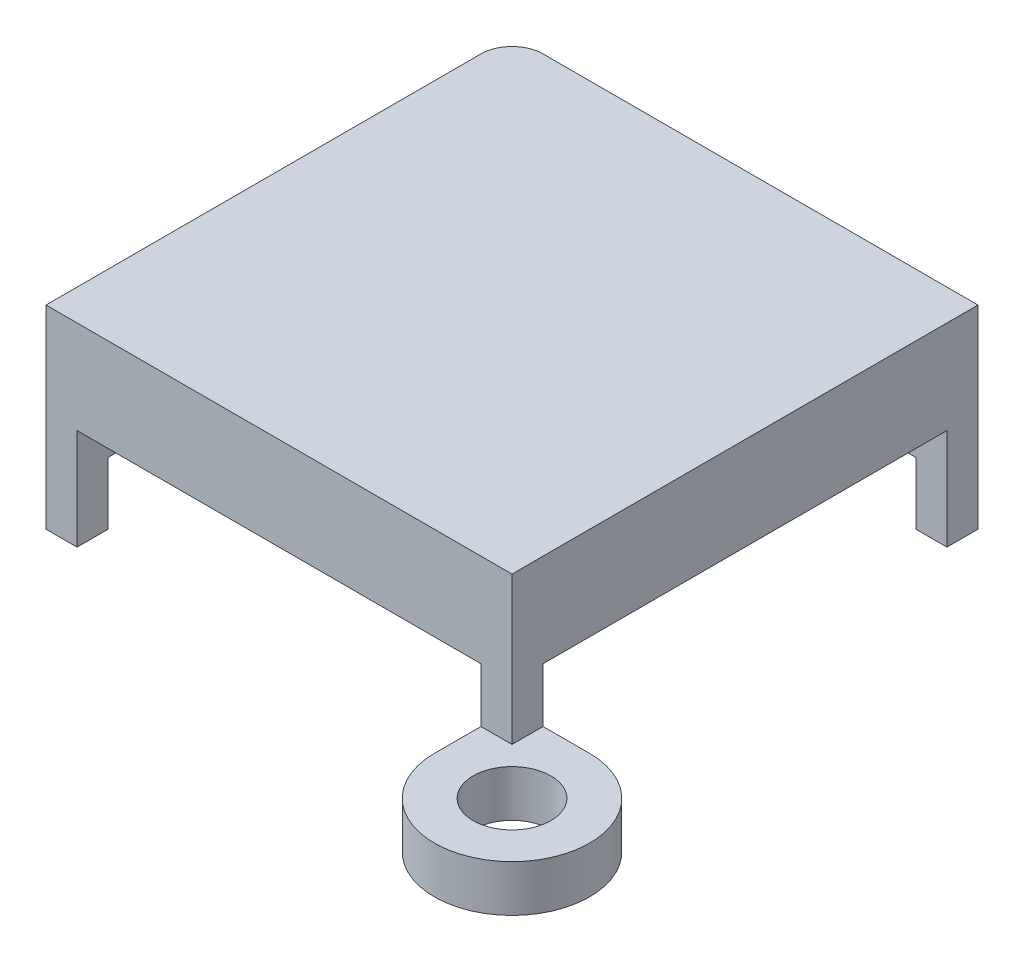
ISO-10303-21;
HEADER;
FILE_DESCRIPTION(('STEP AP214'),'2;1');
FILE_NAME('part.step','',(''),(''),'','','');
FILE_SCHEMA(('AUTOMOTIVE_DESIGN { 1 0 10303 214 1 1 1 1 }'));
ENDSEC;
DATA;
#1=APPLICATION_CONTEXT('core data for automotive mechanical design processes');
#2=APPLICATION_PROTOCOL_DEFINITION('international standard','automotive_design',2000,#1);
#3=PRODUCT_CONTEXT('',#1,'mechanical');
#4=PRODUCT('Part','Part','',(#3));
#5=PRODUCT_RELATED_PRODUCT_CATEGORY('part','',(#4));
#6=PRODUCT_DEFINITION_FORMATION('','',#4);
#7=PRODUCT_DEFINITION_CONTEXT('part definition',#1,'design');
#8=PRODUCT_DEFINITION('design','',#6,#7);
#9=PRODUCT_DEFINITION_SHAPE('','',#8);
#10=(LENGTH_UNIT() NAMED_UNIT(*) SI_UNIT(.MILLI.,.METRE.));
#11=(NAMED_UNIT(*) PLANE_ANGLE_UNIT() SI_UNIT($,.RADIAN.));
#12=(NAMED_UNIT(*) SI_UNIT($,.STERADIAN.) SOLID_ANGLE_UNIT());
#13=UNCERTAINTY_MEASURE_WITH_UNIT(LENGTH_MEASURE(1.E-05),#10,'distance_accuracy_value','');
#14=(GEOMETRIC_REPRESENTATION_CONTEXT(3) GLOBAL_UNCERTAINTY_ASSIGNED_CONTEXT((#13)) GLOBAL_UNIT_ASSIGNED_CONTEXT((#10,
#11,#12)) REPRESENTATION_CONTEXT('',''));
#15=CARTESIAN_POINT('',(0.,0.,0.));
#16=DIRECTION('',(0.,0.,1.));
#17=DIRECTION('',(1.,0.,0.));
#18=AXIS2_PLACEMENT_3D('',#15,#16,#17);
#19=CARTESIAN_POINT('',(0.,-1.2,0.));
#20=DIRECTION('',(0.,-1.,0.));
#21=DIRECTION('',(0.,0.,-1.));
#22=AXIS2_PLACEMENT_3D('',#19,#20,#21);
#23=PLANE('',#22);
#24=DIRECTION('',(0.,0.,-1.));
#25=VECTOR('',#24,1.);
#26=CARTESIAN_POINT('',(-0.5,-1.2,-2.6));
#27=LINE('',#26,#25);
#28=CARTESIAN_POINT('',(-0.5,-1.2,-2.6));
#29=VERTEX_POINT('',#28);
#30=CARTESIAN_POINT('',(-0.5,-1.2,-3.));
#31=VERTEX_POINT('',#30);
#32=EDGE_CURVE('E233',#29,#31,#27,.T.);
#33=ORIENTED_EDGE('',*,*,#32,.F.);
#34=DIRECTION('',(-1.,0.,0.));
#35=VECTOR('',#34,1.);
#36=CARTESIAN_POINT('',(2.6,-1.2,-2.6));
#37=LINE('',#36,#35);
#38=CARTESIAN_POINT('',(-2.6,-1.2,-2.6));
#39=VERTEX_POINT('',#38);
#40=EDGE_CURVE('E292',#29,#39,#37,.T.);
#41=ORIENTED_EDGE('',*,*,#40,.T.);
#42=DIRECTION('',(0.,0.,-1.));
#43=VECTOR('',#42,1.);
#44=CARTESIAN_POINT('',(-2.6,-1.2,-2.6));
#45=LINE('',#44,#43);
#46=CARTESIAN_POINT('',(-2.6,-1.2,-3.));
#47=VERTEX_POINT('',#46);
#48=EDGE_CURVE('E296',#39,#47,#45,.T.);
#49=ORIENTED_EDGE('',*,*,#48,.T.);
#50=DIRECTION('',(1.,0.,0.));
#51=VECTOR('',#50,1.);
#52=CARTESIAN_POINT('',(-2.6,-1.2,-3.));
#53=LINE('',#52,#51);
#54=EDGE_CURVE('E300',#47,#31,#53,.T.);
#55=ORIENTED_EDGE('',*,*,#54,.T.);
#56=EDGE_LOOP('',(#33,#41,#49,#55));
#57=FACE_BOUND('',#56,.T.);
#58=ADVANCED_FACE('F39',(#57),#23,.T.);
#59=CARTESIAN_POINT('',(0.,-1.2,0.));
#60=DIRECTION('',(0.,-1.,0.));
#61=DIRECTION('',(0.,0.,-1.));
#62=AXIS2_PLACEMENT_3D('',#59,#60,#61);
#63=PLANE('',#62);
#64=DIRECTION('',(-1.,0.,0.));
#65=VECTOR('',#64,1.);
#66=CARTESIAN_POINT('',(-3.,-1.2,0.5));
#67=LINE('',#66,#65);
#68=CARTESIAN_POINT('',(-2.6,-1.2,0.5));
#69=VERTEX_POINT('',#68);
#70=CARTESIAN_POINT('',(-3.,-1.2,0.5));
#71=VERTEX_POINT('',#70);
#72=EDGE_CURVE('E269',#69,#71,#67,.T.);
#73=ORIENTED_EDGE('',*,*,#72,.F.);
#74=DIRECTION('',(0.,0.,1.));
#75=VECTOR('',#74,1.);
#76=CARTESIAN_POINT('',(-2.6,-1.2,-2.6));
#77=LINE('',#76,#75);
#78=CARTESIAN_POINT('',(-2.6,-1.2,2.6));
#79=VERTEX_POINT('',#78);
#80=EDGE_CURVE('E305',#69,#79,#77,.T.);
#81=ORIENTED_EDGE('',*,*,#80,.T.);
#82=DIRECTION('',(-1.,0.,0.));
#83=VECTOR('',#82,1.);
#84=CARTESIAN_POINT('',(-2.6,-1.2,2.6));
#85=LINE('',#84,#83);
#86=CARTESIAN_POINT('',(-3.,-1.2,2.6));
#87=VERTEX_POINT('',#86);
#88=EDGE_CURVE('E309',#79,#87,#85,.T.);
#89=ORIENTED_EDGE('',*,*,#88,.T.);
#90=DIRECTION('',(0.,0.,-1.));
#91=VECTOR('',#90,1.);
#92=CARTESIAN_POINT('',(-3.,-1.2,2.6));
#93=LINE('',#92,#91);
#94=EDGE_CURVE('E312',#87,#71,#93,.T.);
#95=ORIENTED_EDGE('',*,*,#94,.T.);
#96=EDGE_LOOP('',(#73,#81,#89,#95));
#97=FACE_BOUND('',#96,.T.);
#98=ADVANCED_FACE('F501',(#97),#63,.T.);
#99=CARTESIAN_POINT('',(-2.6,-2.,2.6));
#100=DIRECTION('',(1.,0.,0.));
#101=DIRECTION('',(0.,0.,-1.));
#102=AXIS2_PLACEMENT_3D('',#99,#100,#101);
#103=PLANE('',#102);
#104=DIRECTION('',(0.,-1.,0.));
#105=VECTOR('',#104,1.);
#106=CARTESIAN_POINT('',(-2.6,-0.7,0.5));
#107=LINE('',#106,#105);
#108=CARTESIAN_POINT('',(-2.6,-0.7,0.5));
#109=VERTEX_POINT('',#108);
#110=EDGE_CURVE('E284',#109,#69,#107,.T.);
#111=ORIENTED_EDGE('',*,*,#110,.F.);
#112=DIRECTION('',(0.,0.,1.));
#113=VECTOR('',#112,1.);
#114=CARTESIAN_POINT('',(-2.6,-0.7,0.5));
#115=LINE('',#114,#113);
#116=CARTESIAN_POINT('',(-2.6,-0.7,-0.5));
#117=VERTEX_POINT('',#116);
#118=EDGE_CURVE('E272',#117,#109,#115,.T.);
#119=ORIENTED_EDGE('',*,*,#118,.F.);
#120=DIRECTION('',(0.,-1.,0.));
#121=VECTOR('',#120,1.);
#122=CARTESIAN_POINT('',(-2.6,-0.7,-0.5));
#123=LINE('',#122,#121);
#124=CARTESIAN_POINT('',(-2.6,-1.2,-0.5));
#125=VERTEX_POINT('',#124);
#126=EDGE_CURVE('E286',#117,#125,#123,.T.);
#127=ORIENTED_EDGE('',*,*,#126,.T.);
#128=EDGE_CURVE('E306',#39,#125,#77,.T.);
#129=ORIENTED_EDGE('',*,*,#128,.F.);
#130=DIRECTION('',(0.,1.,0.));
#131=VECTOR('',#130,1.);
#132=CARTESIAN_POINT('',(-2.6,-2.,-2.6));
#133=LINE('',#132,#131);
#134=CARTESIAN_POINT('',(-2.6,0.,-2.6));
#135=VERTEX_POINT('',#134);
#136=EDGE_CURVE('E421',#39,#135,#133,.T.);
#137=ORIENTED_EDGE('',*,*,#136,.T.);
#138=DIRECTION('',(0.,0.,-1.));
#139=VECTOR('',#138,1.);
#140=CARTESIAN_POINT('',(-2.6,0.,2.6));
#141=LINE('',#140,#139);
#142=CARTESIAN_POINT('',(-2.6,0.,2.6));
#143=VERTEX_POINT('',#142);
#144=EDGE_CURVE('E409',#143,#135,#141,.T.);
#145=ORIENTED_EDGE('',*,*,#144,.F.);
#146=DIRECTION('',(0.,1.,0.));
#147=VECTOR('',#146,1.);
#148=CARTESIAN_POINT('',(-2.6,-2.,2.6));
#149=LINE('',#148,#147);
#150=CARTESIAN_POINT('',(-2.6,-0.7,2.6));
#151=VERTEX_POINT('',#150);
#152=EDGE_CURVE('E423',#151,#143,#149,.T.);
#153=ORIENTED_EDGE('',*,*,#152,.F.);
#154=DIRECTION('',(0.,0.,-1.));
#155=VECTOR('',#154,1.);
#156=CARTESIAN_POINT('',(-2.6,-0.7,3.));
#157=LINE('',#156,#155);
#158=CARTESIAN_POINT('',(-2.6,-0.7,3.));
#159=VERTEX_POINT('',#158);
#160=EDGE_CURVE('E325',#159,#151,#157,.T.);
#161=ORIENTED_EDGE('',*,*,#160,.F.);
#162=DIRECTION('',(0.,1.,0.));
#163=VECTOR('',#162,1.);
#164=CARTESIAN_POINT('',(-2.6,-0.2,3.));
#165=LINE('',#164,#163);
#166=CARTESIAN_POINT('',(-2.6,-2.,3.));
#167=VERTEX_POINT('',#166);
#168=EDGE_CURVE('E365',#167,#159,#165,.T.);
#169=ORIENTED_EDGE('',*,*,#168,.F.);
#170=DIRECTION('',(0.,0.,-1.));
#171=VECTOR('',#170,1.);
#172=CARTESIAN_POINT('',(-2.6,-2.,3.));
#173=LINE('',#172,#171);
#174=CARTESIAN_POINT('',(-2.6,-2.,2.6));
#175=VERTEX_POINT('',#174);
#176=EDGE_CURVE('E372',#167,#175,#173,.T.);
#177=ORIENTED_EDGE('',*,*,#176,.T.);
#178=DIRECTION('',(0.,1.,0.));
#179=VECTOR('',#178,1.);
#180=CARTESIAN_POINT('',(-2.6,-2.,2.6));
#181=LINE('',#180,#179);
#182=EDGE_CURVE('E380',#175,#79,#181,.T.);
#183=ORIENTED_EDGE('',*,*,#182,.T.);
#184=ORIENTED_EDGE('',*,*,#80,.F.);
#185=EDGE_LOOP('',(#111,#119,#127,#129,#137,#145,#153,#161,#169,#177,#183,#184));
#186=FACE_BOUND('',#185,.T.);
#187=ADVANCED_FACE('F496',(#186),#103,.T.);
#188=CARTESIAN_POINT('',(2.6,-2.,-2.6));
#189=DIRECTION('',(-1.,0.,0.));
#190=DIRECTION('',(0.,0.,1.));
#191=AXIS2_PLACEMENT_3D('',#188,#189,#190);
#192=PLANE('',#191);
#193=DIRECTION('',(0.,1.,0.));
#194=VECTOR('',#193,1.);
#195=CARTESIAN_POINT('',(2.6,-2.,-2.6));
#196=LINE('',#195,#194);
#197=CARTESIAN_POINT('',(2.6,-0.7,-2.6));
#198=VERTEX_POINT('',#197);
#199=CARTESIAN_POINT('',(2.6,0.,-2.6));
#200=VERTEX_POINT('',#199);
#201=EDGE_CURVE('E419',#198,#200,#196,.T.);
#202=ORIENTED_EDGE('',*,*,#201,.F.);
#203=DIRECTION('',(0.,0.,-1.));
#204=VECTOR('',#203,1.);
#205=CARTESIAN_POINT('',(2.6,-0.7,2.6));
#206=LINE('',#205,#204);
#207=CARTESIAN_POINT('',(2.6,-0.7,2.6));
#208=VERTEX_POINT('',#207);
#209=EDGE_CURVE('E318',#208,#198,#206,.T.);
#210=ORIENTED_EDGE('',*,*,#209,.F.);
#211=DIRECTION('',(0.,1.,0.));
#212=VECTOR('',#211,1.);
#213=CARTESIAN_POINT('',(2.6,-2.,2.6));
#214=LINE('',#213,#212);
#215=CARTESIAN_POINT('',(2.6,0.,2.6));
#216=VERTEX_POINT('',#215);
#217=EDGE_CURVE('E406',#208,#216,#214,.T.);
#218=ORIENTED_EDGE('',*,*,#217,.T.);
#219=DIRECTION('',(0.,0.,1.));
#220=VECTOR('',#219,1.);
#221=CARTESIAN_POINT('',(2.6,0.,-2.6));
#222=LINE('',#221,#220);
#223=EDGE_CURVE('E415',#200,#216,#222,.T.);
#224=ORIENTED_EDGE('',*,*,#223,.F.);
#225=EDGE_LOOP('',(#202,#210,#218,#224));
#226=FACE_BOUND('',#225,.T.);
#227=ADVANCED_FACE('F493',(#226),#192,.T.);
#228=CARTESIAN_POINT('',(2.6,-2.,2.6));
#229=DIRECTION('',(0.,0.,-1.));
#230=DIRECTION('',(-1.,0.,0.));
#231=AXIS2_PLACEMENT_3D('',#228,#229,#230);
#232=PLANE('',#231);
#233=DIRECTION('',(1.,0.,0.));
#234=VECTOR('',#233,1.);
#235=CARTESIAN_POINT('',(-2.6,-0.7,2.6));
#236=LINE('',#235,#234);
#237=EDGE_CURVE('E328',#151,#208,#236,.T.);
#238=ORIENTED_EDGE('',*,*,#237,.F.);
#239=ORIENTED_EDGE('',*,*,#152,.T.);
#240=DIRECTION('',(-1.,0.,0.));
#241=VECTOR('',#240,1.);
#242=CARTESIAN_POINT('',(2.6,0.,2.6));
#243=LINE('',#242,#241);
#244=EDGE_CURVE('E394',#216,#143,#243,.T.);
#245=ORIENTED_EDGE('',*,*,#244,.F.);
#246=ORIENTED_EDGE('',*,*,#217,.F.);
#247=EDGE_LOOP('',(#238,#239,#245,#246));
#248=FACE_BOUND('',#247,.T.);
#249=ADVANCED_FACE('F614',(#248),#232,.T.);
#250=ORIENTED_EDGE('',*,*,#88,.F.);
#251=ORIENTED_EDGE('',*,*,#182,.F.);
#252=DIRECTION('',(-1.,0.,0.));
#253=VECTOR('',#252,1.);
#254=CARTESIAN_POINT('',(2.6,-2.,2.6));
#255=LINE('',#254,#253);
#256=CARTESIAN_POINT('',(-3.,-2.,2.6));
#257=VERTEX_POINT('',#256);
#258=EDGE_CURVE('E402',#175,#257,#255,.T.);
#259=ORIENTED_EDGE('',*,*,#258,.T.);
#260=DIRECTION('',(0.,1.,0.));
#261=VECTOR('',#260,1.);
#262=CARTESIAN_POINT('',(-3.,-0.2,2.6));
#263=LINE('',#262,#261);
#264=EDGE_CURVE('E391',#257,#87,#263,.T.);
#265=ORIENTED_EDGE('',*,*,#264,.T.);
#266=EDGE_LOOP('',(#250,#251,#259,#265));
#267=FACE_BOUND('',#266,.T.);
#268=ADVANCED_FACE('F567',(#267),#232,.T.);
#269=CARTESIAN_POINT('',(3.,0.5,-3.));
#270=DIRECTION('',(-1.,0.,0.));
#271=DIRECTION('',(0.,0.,1.));
#272=AXIS2_PLACEMENT_3D('',#269,#270,#271);
#273=PLANE('',#272);
#274=DIRECTION('',(0.,0.,1.));
#275=VECTOR('',#274,1.);
#276=CARTESIAN_POINT('',(3.,-0.7,-2.6));
#277=LINE('',#276,#275);
#278=CARTESIAN_POINT('',(3.,-0.7,-2.6));
#279=VERTEX_POINT('',#278);
#280=CARTESIAN_POINT('',(3.,-0.7,2.6));
#281=VERTEX_POINT('',#280);
#282=EDGE_CURVE('E323',#279,#281,#277,.T.);
#283=ORIENTED_EDGE('',*,*,#282,.F.);
#284=DIRECTION('',(0.,-1.,0.));
#285=VECTOR('',#284,1.);
#286=CARTESIAN_POINT('',(3.,-0.2,-2.6));
#287=LINE('',#286,#285);
#288=CARTESIAN_POINT('',(3.,-2.,-2.6));
#289=VERTEX_POINT('',#288);
#290=EDGE_CURVE('E388',#279,#289,#287,.T.);
#291=ORIENTED_EDGE('',*,*,#290,.T.);
#292=DIRECTION('',(0.,0.,1.));
#293=VECTOR('',#292,1.);
#294=CARTESIAN_POINT('',(3.,-2.,-3.));
#295=LINE('',#294,#293);
#296=CARTESIAN_POINT('',(3.,-2.,-3.));
#297=VERTEX_POINT('',#296);
#298=EDGE_CURVE('E427',#297,#289,#295,.T.);
#299=ORIENTED_EDGE('',*,*,#298,.F.);
#300=DIRECTION('',(0.,-1.,0.));
#301=VECTOR('',#300,1.);
#302=CARTESIAN_POINT('',(3.,0.5,-3.));
#303=LINE('',#302,#301);
#304=CARTESIAN_POINT('',(3.,0.5,-3.));
#305=VERTEX_POINT('',#304);
#306=EDGE_CURVE('E450',#305,#297,#303,.T.);
#307=ORIENTED_EDGE('',*,*,#306,.F.);
#308=DIRECTION('',(0.,0.,-1.));
#309=VECTOR('',#308,1.);
#310=CARTESIAN_POINT('',(3.,0.5,-3.));
#311=LINE('',#310,#309);
#312=CARTESIAN_POINT('',(3.,0.5,3.));
#313=VERTEX_POINT('',#312);
#314=EDGE_CURVE('E435',#313,#305,#311,.T.);
#315=ORIENTED_EDGE('',*,*,#314,.F.);
#316=DIRECTION('',(0.,-1.,0.));
#317=VECTOR('',#316,1.);
#318=CARTESIAN_POINT('',(3.,0.5,3.));
#319=LINE('',#318,#317);
#320=CARTESIAN_POINT('',(3.,-1.4,3.));
#321=VERTEX_POINT('',#320);
#322=EDGE_CURVE('E444',#313,#321,#319,.T.);
#323=ORIENTED_EDGE('',*,*,#322,.T.);
#324=DIRECTION('',(0.,0.,1.));
#325=VECTOR('',#324,1.);
#326=CARTESIAN_POINT('',(3.,-1.4,-3.));
#327=LINE('',#326,#325);
#328=CARTESIAN_POINT('',(3.,-1.4,2.6));
#329=VERTEX_POINT('',#328);
#330=EDGE_CURVE('E360',#329,#321,#327,.T.);
#331=ORIENTED_EDGE('',*,*,#330,.F.);
#332=DIRECTION('',(0.,1.,0.));
#333=VECTOR('',#332,1.);
#334=CARTESIAN_POINT('',(3.,-0.2,2.6));
#335=LINE('',#334,#333);
#336=EDGE_CURVE('E390',#329,#281,#335,.T.);
#337=ORIENTED_EDGE('',*,*,#336,.T.);
#338=EDGE_LOOP('',(#283,#291,#299,#307,#315,#323,#331,#337));
#339=FACE_BOUND('',#338,.T.);
#340=ADVANCED_FACE('F586',(#339),#273,.F.);
#341=CARTESIAN_POINT('',(-3.,0.5,3.));
#342=DIRECTION('',(0.,0.,-1.));
#343=DIRECTION('',(-1.,0.,0.));
#344=AXIS2_PLACEMENT_3D('',#341,#342,#343);
#345=PLANE('',#344);
#346=DIRECTION('',(-1.,0.,0.));
#347=VECTOR('',#346,1.);
#348=CARTESIAN_POINT('',(2.6,-0.7,3.));
#349=LINE('',#348,#347);
#350=CARTESIAN_POINT('',(2.6,-0.7,3.));
#351=VERTEX_POINT('',#350);
#352=EDGE_CURVE('E333',#351,#159,#349,.T.);
#353=ORIENTED_EDGE('',*,*,#352,.F.);
#354=DIRECTION('',(0.,-1.,0.));
#355=VECTOR('',#354,1.);
#356=CARTESIAN_POINT('',(2.6,-0.2,3.));
#357=LINE('',#356,#355);
#358=CARTESIAN_POINT('',(2.6,-1.4,3.));
#359=VERTEX_POINT('',#358);
#360=EDGE_CURVE('E363',#351,#359,#357,.T.);
#361=ORIENTED_EDGE('',*,*,#360,.T.);
#362=DIRECTION('',(-1.,0.,0.));
#363=VECTOR('',#362,1.);
#364=CARTESIAN_POINT('',(-3.,-1.4,3.));
#365=LINE('',#364,#363);
#366=EDGE_CURVE('E355',#321,#359,#365,.T.);
#367=ORIENTED_EDGE('',*,*,#366,.F.);
#368=ORIENTED_EDGE('',*,*,#322,.F.);
#369=DIRECTION('',(1.,0.,0.));
#370=VECTOR('',#369,1.);
#371=CARTESIAN_POINT('',(-3.,0.5,3.));
#372=LINE('',#371,#370);
#373=CARTESIAN_POINT('',(-3.,0.5,3.));
#374=VERTEX_POINT('',#373);
#375=EDGE_CURVE('E442',#374,#313,#372,.T.);
#376=ORIENTED_EDGE('',*,*,#375,.F.);
#377=DIRECTION('',(0.,-1.,0.));
#378=VECTOR('',#377,1.);
#379=CARTESIAN_POINT('',(-3.,0.5,3.));
#380=LINE('',#379,#378);
#381=CARTESIAN_POINT('',(-3.,-2.,3.));
#382=VERTEX_POINT('',#381);
#383=EDGE_CURVE('E447',#374,#382,#380,.T.);
#384=ORIENTED_EDGE('',*,*,#383,.T.);
#385=DIRECTION('',(-1.,0.,0.));
#386=VECTOR('',#385,1.);
#387=CARTESIAN_POINT('',(3.,-2.,3.));
#388=LINE('',#387,#386);
#389=EDGE_CURVE('E430',#167,#382,#388,.T.);
#390=ORIENTED_EDGE('',*,*,#389,.F.);
#391=ORIENTED_EDGE('',*,*,#168,.T.);
#392=EDGE_LOOP('',(#353,#361,#367,#368,#376,#384,#390,#391));
#393=FACE_BOUND('',#392,.T.);
#394=ADVANCED_FACE('F576',(#393),#345,.F.);
#395=CARTESIAN_POINT('',(0.,-2.,0.));
#396=DIRECTION('',(0.,-1.,0.));
#397=DIRECTION('',(0.,0.,-1.));
#398=AXIS2_PLACEMENT_3D('',#395,#396,#397);
#399=PLANE('',#398);
#400=DIRECTION('',(0.,0.,-1.));
#401=VECTOR('',#400,1.);
#402=CARTESIAN_POINT('',(2.6,-2.,3.));
#403=LINE('',#402,#401);
#404=CARTESIAN_POINT('',(2.6,-2.,-2.6));
#405=VERTEX_POINT('',#404);
#406=CARTESIAN_POINT('',(2.6,-2.,-3.));
#407=VERTEX_POINT('',#406);
#408=EDGE_CURVE('E369',#405,#407,#403,.T.);
#409=ORIENTED_EDGE('',*,*,#408,.T.);
#410=DIRECTION('',(1.,0.,0.));
#411=VECTOR('',#410,1.);
#412=CARTESIAN_POINT('',(-3.,-2.,-3.));
#413=LINE('',#412,#411);
#414=EDGE_CURVE('E425',#407,#297,#413,.T.);
#415=ORIENTED_EDGE('',*,*,#414,.T.);
#416=ORIENTED_EDGE('',*,*,#298,.T.);
#417=DIRECTION('',(1.,0.,0.));
#418=VECTOR('',#417,1.);
#419=CARTESIAN_POINT('',(-2.6,-2.,-2.6));
#420=LINE('',#419,#418);
#421=EDGE_CURVE('E401',#405,#289,#420,.T.);
#422=ORIENTED_EDGE('',*,*,#421,.F.);
#423=EDGE_LOOP('',(#409,#415,#416,#422));
#424=FACE_BOUND('',#423,.T.);
#425=ADVANCED_FACE('F532',(#424),#399,.T.);
#426=CARTESIAN_POINT('',(2.6,-2.,3.6));
#427=VERTEX_POINT('',#426);
#428=CARTESIAN_POINT('',(2.6,-2.,2.6));
#429=VERTEX_POINT('',#428);
#430=EDGE_CURVE('E376',#427,#429,#403,.T.);
#431=ORIENTED_EDGE('',*,*,#430,.T.);
#432=CARTESIAN_POINT('',(3.6,-2.,2.6));
#433=VERTEX_POINT('',#432);
#434=EDGE_CURVE('E398',#433,#429,#255,.T.);
#435=ORIENTED_EDGE('',*,*,#434,.F.);
#436=CARTESIAN_POINT('',(3.6,-2.,3.6));
#437=DIRECTION('',(0.,-1.,0.));
#438=DIRECTION('',(0.,0.,-1.));
#439=AXIS2_PLACEMENT_3D('',#436,#437,#438);
#440=CIRCLE('',#439,1.);
#441=EDGE_CURVE('E335',#433,#427,#440,.T.);
#442=ORIENTED_EDGE('',*,*,#441,.T.);
#443=EDGE_LOOP('',(#431,#435,#442));
#444=FACE_BOUND('',#443,.T.);
#445=CARTESIAN_POINT('',(3.6,-2.,3.6));
#446=DIRECTION('',(0.,-1.,0.));
#447=DIRECTION('',(0.,0.,-1.));
#448=AXIS2_PLACEMENT_3D('',#445,#446,#447);
#449=CIRCLE('',#448,0.5);
#450=CARTESIAN_POINT('',(3.6,-2.,3.1));
#451=VERTEX_POINT('',#450);
#452=EDGE_CURVE('E339',#451,#451,#449,.T.);
#453=ORIENTED_EDGE('',*,*,#452,.F.);
#454=EDGE_LOOP('',(#453));
#455=FACE_BOUND('',#454,.T.);
#456=ADVANCED_FACE('F498',(#444,#455),#399,.T.);
#457=CARTESIAN_POINT('',(-2.6,-2.,-2.6));
#458=DIRECTION('',(0.,0.,1.));
#459=DIRECTION('',(1.,0.,0.));
#460=AXIS2_PLACEMENT_3D('',#457,#458,#459);
#461=PLANE('',#460);
#462=DIRECTION('',(0.,-1.,0.));
#463=VECTOR('',#462,1.);
#464=CARTESIAN_POINT('',(-0.5,-0.7,-2.6));
#465=LINE('',#464,#463);
#466=CARTESIAN_POINT('',(-0.5,-0.7,-2.6));
#467=VERTEX_POINT('',#466);
#468=EDGE_CURVE('E258',#467,#29,#465,.T.);
#469=ORIENTED_EDGE('',*,*,#468,.F.);
#470=DIRECTION('',(-1.,0.,0.));
#471=VECTOR('',#470,1.);
#472=CARTESIAN_POINT('',(-0.5,-0.7,-2.6));
#473=LINE('',#472,#471);
#474=CARTESIAN_POINT('',(0.5,-0.7,-2.6));
#475=VERTEX_POINT('',#474);
#476=EDGE_CURVE('E237',#475,#467,#473,.T.);
#477=ORIENTED_EDGE('',*,*,#476,.F.);
#478=DIRECTION('',(0.,-1.,0.));
#479=VECTOR('',#478,1.);
#480=CARTESIAN_POINT('',(0.5,-0.7,-2.6));
#481=LINE('',#480,#479);
#482=CARTESIAN_POINT('',(0.5,-1.2,-2.6));
#483=VERTEX_POINT('',#482);
#484=EDGE_CURVE('E261',#475,#483,#481,.T.);
#485=ORIENTED_EDGE('',*,*,#484,.T.);
#486=CARTESIAN_POINT('',(2.6,-1.2,-2.6));
#487=VERTEX_POINT('',#486);
#488=EDGE_CURVE('E293',#487,#483,#37,.T.);
#489=ORIENTED_EDGE('',*,*,#488,.F.);
#490=DIRECTION('',(0.,1.,0.));
#491=VECTOR('',#490,1.);
#492=CARTESIAN_POINT('',(2.6,-2.,-2.6));
#493=LINE('',#492,#491);
#494=EDGE_CURVE('E383',#405,#487,#493,.T.);
#495=ORIENTED_EDGE('',*,*,#494,.F.);
#496=ORIENTED_EDGE('',*,*,#421,.T.);
#497=ORIENTED_EDGE('',*,*,#290,.F.);
#498=DIRECTION('',(1.,0.,0.));
#499=VECTOR('',#498,1.);
#500=CARTESIAN_POINT('',(2.6,-0.7,-2.6));
#501=LINE('',#500,#499);
#502=EDGE_CURVE('E321',#198,#279,#501,.T.);
#503=ORIENTED_EDGE('',*,*,#502,.F.);
#504=ORIENTED_EDGE('',*,*,#201,.T.);
#505=DIRECTION('',(1.,0.,0.));
#506=VECTOR('',#505,1.);
#507=CARTESIAN_POINT('',(-2.6,0.,-2.6));
#508=LINE('',#507,#506);
#509=EDGE_CURVE('E412',#135,#200,#508,.T.);
#510=ORIENTED_EDGE('',*,*,#509,.F.);
#511=ORIENTED_EDGE('',*,*,#136,.F.);
#512=ORIENTED_EDGE('',*,*,#40,.F.);
#513=EDGE_LOOP('',(#469,#477,#485,#489,#495,#496,#497,#503,#504,#510,#511,#512));
#514=FACE_BOUND('',#513,.T.);
#515=ADVANCED_FACE('F485',(#514),#461,.T.);
#516=CARTESIAN_POINT('',(-3.,-2.,-2.6));
#517=VERTEX_POINT('',#516);
#518=CARTESIAN_POINT('',(-2.6,-2.,-2.6));
#519=VERTEX_POINT('',#518);
#520=EDGE_CURVE('E403',#517,#519,#420,.T.);
#521=ORIENTED_EDGE('',*,*,#520,.F.);
#522=CARTESIAN_POINT('',(-2.6,-2.,-2.6));
#523=DIRECTION('',(0.,-1.,0.));
#524=DIRECTION('',(0.,0.,-1.));
#525=AXIS2_PLACEMENT_3D('',#522,#523,#524);
#526=CIRCLE('',#525,0.4);
#527=CARTESIAN_POINT('',(-2.6,-2.,-3.));
#528=VERTEX_POINT('',#527);
#529=EDGE_CURVE('E456',#517,#528,#526,.T.);
#530=ORIENTED_EDGE('',*,*,#529,.T.);
#531=EDGE_CURVE('E375',#519,#528,#173,.T.);
#532=ORIENTED_EDGE('',*,*,#531,.F.);
#533=EDGE_LOOP('',(#521,#530,#532));
#534=FACE_BOUND('',#533,.T.);
#535=ADVANCED_FACE('F462',(#534),#399,.T.);
#536=CARTESIAN_POINT('',(-3.,0.5,-3.));
#537=DIRECTION('',(0.,0.,1.));
#538=DIRECTION('',(1.,0.,0.));
#539=AXIS2_PLACEMENT_3D('',#536,#537,#538);
#540=PLANE('',#539);
#541=ORIENTED_EDGE('',*,*,#54,.F.);
#542=DIRECTION('',(0.,-1.,0.));
#543=VECTOR('',#542,1.);
#544=CARTESIAN_POINT('',(-2.6,0.5,-3.));
#545=LINE('',#544,#543);
#546=CARTESIAN_POINT('',(-2.6,0.5,-3.));
#547=VERTEX_POINT('',#546);
#548=EDGE_CURVE('E47',#47,#547,#545,.F.);
#549=ORIENTED_EDGE('',*,*,#548,.T.);
#550=DIRECTION('',(-1.,0.,0.));
#551=VECTOR('',#550,1.);
#552=CARTESIAN_POINT('',(-3.,0.5,-3.));
#553=LINE('',#552,#551);
#554=EDGE_CURVE('E438',#305,#547,#553,.T.);
#555=ORIENTED_EDGE('',*,*,#554,.F.);
#556=ORIENTED_EDGE('',*,*,#306,.T.);
#557=ORIENTED_EDGE('',*,*,#414,.F.);
#558=DIRECTION('',(0.,-1.,0.));
#559=VECTOR('',#558,1.);
#560=CARTESIAN_POINT('',(2.6,-0.2,-3.));
#561=LINE('',#560,#559);
#562=CARTESIAN_POINT('',(2.6,-1.2,-3.));
#563=VERTEX_POINT('',#562);
#564=EDGE_CURVE('E362',#563,#407,#561,.T.);
#565=ORIENTED_EDGE('',*,*,#564,.F.);
#566=CARTESIAN_POINT('',(0.5,-1.2,-3.));
#567=VERTEX_POINT('',#566);
#568=EDGE_CURVE('E299',#567,#563,#53,.T.);
#569=ORIENTED_EDGE('',*,*,#568,.F.);
#570=DIRECTION('',(0.,-1.,0.));
#571=VECTOR('',#570,1.);
#572=CARTESIAN_POINT('',(0.5,-0.7,-3.));
#573=LINE('',#572,#571);
#574=CARTESIAN_POINT('',(0.5,-0.7,-3.));
#575=VERTEX_POINT('',#574);
#576=EDGE_CURVE('E236',#575,#567,#573,.T.);
#577=ORIENTED_EDGE('',*,*,#576,.F.);
#578=DIRECTION('',(1.,0.,0.));
#579=VECTOR('',#578,1.);
#580=CARTESIAN_POINT('',(-0.5,-0.7,-3.));
#581=LINE('',#580,#579);
#582=CARTESIAN_POINT('',(-0.5,-0.7,-3.));
#583=VERTEX_POINT('',#582);
#584=EDGE_CURVE('E243',#583,#575,#581,.T.);
#585=ORIENTED_EDGE('',*,*,#584,.F.);
#586=DIRECTION('',(0.,-1.,0.));
#587=VECTOR('',#586,1.);
#588=CARTESIAN_POINT('',(-0.5,-0.7,-3.));
#589=LINE('',#588,#587);
#590=EDGE_CURVE('E227',#583,#31,#589,.T.);
#591=ORIENTED_EDGE('',*,*,#590,.T.);
#592=EDGE_LOOP('',(#541,#549,#555,#556,#557,#565,#569,#577,#585,#591));
#593=FACE_BOUND('',#592,.T.);
#594=ADVANCED_FACE('F249',(#593),#540,.F.);
#595=CARTESIAN_POINT('',(-3.,0.5,-3.));
#596=DIRECTION('',(1.,0.,0.));
#597=DIRECTION('',(0.,0.,-1.));
#598=AXIS2_PLACEMENT_3D('',#595,#596,#597);
#599=PLANE('',#598);
#600=DIRECTION('',(0.,0.,1.));
#601=VECTOR('',#600,1.);
#602=CARTESIAN_POINT('',(-3.,0.5,-3.));
#603=LINE('',#602,#601);
#604=CARTESIAN_POINT('',(-3.,0.5,-2.6));
#605=VERTEX_POINT('',#604);
#606=EDGE_CURVE('E440',#605,#374,#603,.T.);
#607=ORIENTED_EDGE('',*,*,#606,.F.);
#608=DIRECTION('',(0.,-1.,0.));
#609=VECTOR('',#608,1.);
#610=CARTESIAN_POINT('',(-3.,0.5,-2.6));
#611=LINE('',#610,#609);
#612=CARTESIAN_POINT('',(-3.,-1.2,-2.6));
#613=VERTEX_POINT('',#612);
#614=EDGE_CURVE('E453',#605,#613,#611,.T.);
#615=ORIENTED_EDGE('',*,*,#614,.T.);
#616=CARTESIAN_POINT('',(-3.,-1.2,-0.5));
#617=VERTEX_POINT('',#616);
#618=EDGE_CURVE('E311',#617,#613,#93,.T.);
#619=ORIENTED_EDGE('',*,*,#618,.F.);
#620=DIRECTION('',(0.,-1.,0.));
#621=VECTOR('',#620,1.);
#622=CARTESIAN_POINT('',(-3.,-0.7,-0.5));
#623=LINE('',#622,#621);
#624=CARTESIAN_POINT('',(-3.,-0.7,-0.5));
#625=VERTEX_POINT('',#624);
#626=EDGE_CURVE('E277',#625,#617,#623,.T.);
#627=ORIENTED_EDGE('',*,*,#626,.F.);
#628=DIRECTION('',(0.,0.,-1.));
#629=VECTOR('',#628,1.);
#630=CARTESIAN_POINT('',(-3.,-0.7,0.5));
#631=LINE('',#630,#629);
#632=CARTESIAN_POINT('',(-3.,-0.7,0.5));
#633=VERTEX_POINT('',#632);
#634=EDGE_CURVE('E265',#633,#625,#631,.T.);
#635=ORIENTED_EDGE('',*,*,#634,.F.);
#636=DIRECTION('',(0.,-1.,0.));
#637=VECTOR('',#636,1.);
#638=CARTESIAN_POINT('',(-3.,-0.7,0.5));
#639=LINE('',#638,#637);
#640=EDGE_CURVE('E280',#633,#71,#639,.T.);
#641=ORIENTED_EDGE('',*,*,#640,.T.);
#642=ORIENTED_EDGE('',*,*,#94,.F.);
#643=ORIENTED_EDGE('',*,*,#264,.F.);
#644=DIRECTION('',(0.,0.,-1.));
#645=VECTOR('',#644,1.);
#646=CARTESIAN_POINT('',(-3.,-2.,3.));
#647=LINE('',#646,#645);
#648=EDGE_CURVE('E432',#382,#257,#647,.T.);
#649=ORIENTED_EDGE('',*,*,#648,.F.);
#650=ORIENTED_EDGE('',*,*,#383,.F.);
#651=EDGE_LOOP('',(#607,#615,#619,#627,#635,#641,#642,#643,#649,#650));
#652=FACE_BOUND('',#651,.T.);
#653=ADVANCED_FACE('F473',(#652),#599,.F.);
#654=CARTESIAN_POINT('',(0.,0.5,0.));
#655=DIRECTION('',(0.,1.,0.));
#656=DIRECTION('',(0.,0.,1.));
#657=AXIS2_PLACEMENT_3D('',#654,#655,#656);
#658=PLANE('',#657);
#659=ORIENTED_EDGE('',*,*,#554,.T.);
#660=CARTESIAN_POINT('',(-2.6,0.5,-2.6));
#661=DIRECTION('',(0.,1.,0.));
#662=DIRECTION('',(0.,0.,1.));
#663=AXIS2_PLACEMENT_3D('',#660,#661,#662);
#664=CIRCLE('',#663,0.4);
#665=EDGE_CURVE('E11',#547,#605,#664,.T.);
#666=ORIENTED_EDGE('',*,*,#665,.T.);
#667=ORIENTED_EDGE('',*,*,#606,.T.);
#668=ORIENTED_EDGE('',*,*,#375,.T.);
#669=ORIENTED_EDGE('',*,*,#314,.T.);
#670=EDGE_LOOP('',(#659,#666,#667,#668,#669));
#671=FACE_BOUND('',#670,.T.);
#672=ADVANCED_FACE('F582',(#671),#658,.T.);
#673=ORIENTED_EDGE('',*,*,#176,.F.);
#674=ORIENTED_EDGE('',*,*,#389,.T.);
#675=ORIENTED_EDGE('',*,*,#648,.T.);
#676=ORIENTED_EDGE('',*,*,#258,.F.);
#677=EDGE_LOOP('',(#673,#674,#675,#676));
#678=FACE_BOUND('',#677,.T.);
#679=ADVANCED_FACE('F573',(#678),#399,.T.);
#680=DIRECTION('',(-1.,0.,0.));
#681=VECTOR('',#680,1.);
#682=CARTESIAN_POINT('',(3.,-0.7,2.6));
#683=LINE('',#682,#681);
#684=EDGE_CURVE('E315',#281,#208,#683,.T.);
#685=ORIENTED_EDGE('',*,*,#684,.F.);
#686=ORIENTED_EDGE('',*,*,#336,.F.);
#687=DIRECTION('',(1.,0.,0.));
#688=VECTOR('',#687,1.);
#689=CARTESIAN_POINT('',(0.,-1.4,2.6));
#690=LINE('',#689,#688);
#691=CARTESIAN_POINT('',(3.6,-1.4,2.6));
#692=VERTEX_POINT('',#691);
#693=EDGE_CURVE('E338',#329,#692,#690,.T.);
#694=ORIENTED_EDGE('',*,*,#693,.T.);
#695=DIRECTION('',(0.,-1.,0.));
#696=VECTOR('',#695,1.);
#697=CARTESIAN_POINT('',(3.6,-1.4,2.6));
#698=LINE('',#697,#696);
#699=EDGE_CURVE('E347',#692,#433,#698,.T.);
#700=ORIENTED_EDGE('',*,*,#699,.T.);
#701=ORIENTED_EDGE('',*,*,#434,.T.);
#702=DIRECTION('',(0.,-1.,0.));
#703=VECTOR('',#702,1.);
#704=CARTESIAN_POINT('',(2.6,-2.,2.6));
#705=LINE('',#704,#703);
#706=EDGE_CURVE('E385',#208,#429,#705,.T.);
#707=ORIENTED_EDGE('',*,*,#706,.F.);
#708=EDGE_LOOP('',(#685,#686,#694,#700,#701,#707));
#709=FACE_BOUND('',#708,.T.);
#710=ADVANCED_FACE('F494',(#709),#232,.T.);
#711=ORIENTED_EDGE('',*,*,#48,.F.);
#712=DIRECTION('',(0.,-1.,0.));
#713=VECTOR('',#712,1.);
#714=CARTESIAN_POINT('',(-2.6,-2.,-2.6));
#715=LINE('',#714,#713);
#716=EDGE_CURVE('E374',#39,#519,#715,.T.);
#717=ORIENTED_EDGE('',*,*,#716,.T.);
#718=ORIENTED_EDGE('',*,*,#531,.T.);
#719=DIRECTION('',(0.,1.,0.));
#720=VECTOR('',#719,1.);
#721=CARTESIAN_POINT('',(-2.6,-0.2,-3.));
#722=LINE('',#721,#720);
#723=EDGE_CURVE('E366',#528,#47,#722,.T.);
#724=ORIENTED_EDGE('',*,*,#723,.T.);
#725=EDGE_LOOP('',(#711,#717,#718,#724));
#726=FACE_BOUND('',#725,.T.);
#727=ADVANCED_FACE('F467',(#726),#103,.T.);
#728=DIRECTION('',(1.,0.,0.));
#729=VECTOR('',#728,1.);
#730=CARTESIAN_POINT('',(-3.,-1.2,-2.6));
#731=LINE('',#730,#729);
#732=EDGE_CURVE('E302',#613,#39,#731,.T.);
#733=ORIENTED_EDGE('',*,*,#732,.F.);
#734=DIRECTION('',(0.,-1.,0.));
#735=VECTOR('',#734,1.);
#736=CARTESIAN_POINT('',(-3.,-0.2,-2.6));
#737=LINE('',#736,#735);
#738=EDGE_CURVE('E387',#613,#517,#737,.T.);
#739=ORIENTED_EDGE('',*,*,#738,.T.);
#740=ORIENTED_EDGE('',*,*,#520,.T.);
#741=ORIENTED_EDGE('',*,*,#716,.F.);
#742=EDGE_LOOP('',(#733,#739,#740,#741));
#743=FACE_BOUND('',#742,.T.);
#744=ADVANCED_FACE('F481',(#743),#461,.T.);
#745=DIRECTION('',(0.,0.,1.));
#746=VECTOR('',#745,1.);
#747=CARTESIAN_POINT('',(2.6,-1.2,-3.));
#748=LINE('',#747,#746);
#749=EDGE_CURVE('E283',#563,#487,#748,.T.);
#750=ORIENTED_EDGE('',*,*,#749,.F.);
#751=ORIENTED_EDGE('',*,*,#564,.T.);
#752=ORIENTED_EDGE('',*,*,#408,.F.);
#753=ORIENTED_EDGE('',*,*,#494,.T.);
#754=EDGE_LOOP('',(#750,#751,#752,#753));
#755=FACE_BOUND('',#754,.T.);
#756=ADVANCED_FACE('F483',(#755),#192,.T.);
#757=CARTESIAN_POINT('',(0.,0.,0.));
#758=DIRECTION('',(0.,1.,0.));
#759=DIRECTION('',(0.,0.,1.));
#760=AXIS2_PLACEMENT_3D('',#757,#758,#759);
#761=PLANE('',#760);
#762=ORIENTED_EDGE('',*,*,#223,.T.);
#763=ORIENTED_EDGE('',*,*,#244,.T.);
#764=ORIENTED_EDGE('',*,*,#144,.T.);
#765=ORIENTED_EDGE('',*,*,#509,.T.);
#766=EDGE_LOOP('',(#762,#763,#764,#765));
#767=FACE_BOUND('',#766,.T.);
#768=ADVANCED_FACE('F490',(#767),#761,.F.);
#769=CARTESIAN_POINT('',(2.6,-0.2,3.));
#770=DIRECTION('',(1.,0.,0.));
#771=DIRECTION('',(0.,1.,0.));
#772=AXIS2_PLACEMENT_3D('',#769,#770,#771);
#773=PLANE('',#772);
#774=ORIENTED_EDGE('',*,*,#360,.F.);
#775=DIRECTION('',(0.,0.,1.));
#776=VECTOR('',#775,1.);
#777=CARTESIAN_POINT('',(2.6,-0.7,2.6));
#778=LINE('',#777,#776);
#779=EDGE_CURVE('E331',#208,#351,#778,.T.);
#780=ORIENTED_EDGE('',*,*,#779,.F.);
#781=ORIENTED_EDGE('',*,*,#706,.T.);
#782=ORIENTED_EDGE('',*,*,#430,.F.);
#783=DIRECTION('',(0.,-1.,0.));
#784=VECTOR('',#783,1.);
#785=CARTESIAN_POINT('',(2.6,-1.4,3.6));
#786=LINE('',#785,#784);
#787=CARTESIAN_POINT('',(2.6,-1.4,3.6));
#788=VERTEX_POINT('',#787);
#789=EDGE_CURVE('E352',#788,#427,#786,.T.);
#790=ORIENTED_EDGE('',*,*,#789,.F.);
#791=DIRECTION('',(0.,0.,1.));
#792=VECTOR('',#791,1.);
#793=CARTESIAN_POINT('',(2.6,-1.4,0.));
#794=LINE('',#793,#792);
#795=EDGE_CURVE('E336',#359,#788,#794,.T.);
#796=ORIENTED_EDGE('',*,*,#795,.F.);
#797=EDGE_LOOP('',(#774,#780,#781,#782,#790,#796));
#798=FACE_BOUND('',#797,.T.);
#799=ADVANCED_FACE('F596',(#798),#773,.F.);
#800=CARTESIAN_POINT('',(0.,-1.4,0.));
#801=DIRECTION('',(0.,-1.,0.));
#802=DIRECTION('',(0.,0.,-1.));
#803=AXIS2_PLACEMENT_3D('',#800,#801,#802);
#804=PLANE('',#803);
#805=CARTESIAN_POINT('',(3.6,-1.4,3.6));
#806=DIRECTION('',(0.,-1.,0.));
#807=DIRECTION('',(0.,0.,-1.));
#808=AXIS2_PLACEMENT_3D('',#805,#806,#807);
#809=CIRCLE('',#808,0.5);
#810=CARTESIAN_POINT('',(3.6,-1.4,3.1));
#811=VERTEX_POINT('',#810);
#812=EDGE_CURVE('E344',#811,#811,#809,.T.);
#813=ORIENTED_EDGE('',*,*,#812,.T.);
#814=EDGE_LOOP('',(#813));
#815=FACE_BOUND('',#814,.T.);
#816=ORIENTED_EDGE('',*,*,#693,.F.);
#817=ORIENTED_EDGE('',*,*,#330,.T.);
#818=ORIENTED_EDGE('',*,*,#366,.T.);
#819=ORIENTED_EDGE('',*,*,#795,.T.);
#820=CARTESIAN_POINT('',(3.6,-1.4,3.6));
#821=DIRECTION('',(0.,-1.,0.));
#822=DIRECTION('',(0.,0.,-1.));
#823=AXIS2_PLACEMENT_3D('',#820,#821,#822);
#824=CIRCLE('',#823,1.);
#825=EDGE_CURVE('E341',#692,#788,#824,.T.);
#826=ORIENTED_EDGE('',*,*,#825,.F.);
#827=EDGE_LOOP('',(#816,#817,#818,#819,#826));
#828=FACE_BOUND('',#827,.T.);
#829=ADVANCED_FACE('F607',(#815,#828),#804,.F.);
#830=CARTESIAN_POINT('',(3.6,-1.4,3.6));
#831=DIRECTION('',(0.,-1.,0.));
#832=DIRECTION('',(0.,0.,-1.));
#833=AXIS2_PLACEMENT_3D('',#830,#831,#832);
#834=CYLINDRICAL_SURFACE('',#833,1.);
#835=ORIENTED_EDGE('',*,*,#441,.F.);
#836=ORIENTED_EDGE('',*,*,#699,.F.);
#837=ORIENTED_EDGE('',*,*,#825,.T.);
#838=ORIENTED_EDGE('',*,*,#789,.T.);
#839=EDGE_LOOP('',(#835,#836,#837,#838));
#840=FACE_BOUND('',#839,.T.);
#841=ADVANCED_FACE('F603',(#840),#834,.T.);
#842=CARTESIAN_POINT('',(3.6,-1.4,3.6));
#843=DIRECTION('',(0.,-1.,0.));
#844=DIRECTION('',(0.,0.,-1.));
#845=AXIS2_PLACEMENT_3D('',#842,#843,#844);
#846=CYLINDRICAL_SURFACE('',#845,0.5);
#847=ORIENTED_EDGE('',*,*,#812,.F.);
#848=EDGE_LOOP('',(#847));
#849=FACE_BOUND('',#848,.T.);
#850=ORIENTED_EDGE('',*,*,#452,.T.);
#851=EDGE_LOOP('',(#850));
#852=FACE_BOUND('',#851,.T.);
#853=ADVANCED_FACE('F781',(#849,#852),#846,.F.);
#854=CARTESIAN_POINT('',(0.,-0.7,0.));
#855=DIRECTION('',(0.,-1.,0.));
#856=DIRECTION('',(0.,0.,-1.));
#857=AXIS2_PLACEMENT_3D('',#854,#855,#856);
#858=PLANE('',#857);
#859=ORIENTED_EDGE('',*,*,#160,.T.);
#860=ORIENTED_EDGE('',*,*,#237,.T.);
#861=ORIENTED_EDGE('',*,*,#779,.T.);
#862=ORIENTED_EDGE('',*,*,#352,.T.);
#863=EDGE_LOOP('',(#859,#860,#861,#862));
#864=FACE_BOUND('',#863,.T.);
#865=ADVANCED_FACE('F609',(#864),#858,.T.);
#866=CARTESIAN_POINT('',(0.,-0.7,0.));
#867=DIRECTION('',(0.,-1.,0.));
#868=DIRECTION('',(0.,0.,-1.));
#869=AXIS2_PLACEMENT_3D('',#866,#867,#868);
#870=PLANE('',#869);
#871=ORIENTED_EDGE('',*,*,#684,.T.);
#872=ORIENTED_EDGE('',*,*,#209,.T.);
#873=ORIENTED_EDGE('',*,*,#502,.T.);
#874=ORIENTED_EDGE('',*,*,#282,.T.);
#875=EDGE_LOOP('',(#871,#872,#873,#874));
#876=FACE_BOUND('',#875,.T.);
#877=ADVANCED_FACE('F521',(#876),#870,.T.);
#878=DIRECTION('',(1.,0.,0.));
#879=VECTOR('',#878,1.);
#880=CARTESIAN_POINT('',(-3.,-1.2,-0.5));
#881=LINE('',#880,#879);
#882=EDGE_CURVE('E260',#617,#125,#881,.T.);
#883=ORIENTED_EDGE('',*,*,#882,.F.);
#884=ORIENTED_EDGE('',*,*,#618,.T.);
#885=ORIENTED_EDGE('',*,*,#732,.T.);
#886=ORIENTED_EDGE('',*,*,#128,.T.);
#887=EDGE_LOOP('',(#883,#884,#885,#886));
#888=FACE_BOUND('',#887,.T.);
#889=ADVANCED_FACE('F479',(#888),#63,.T.);
#890=DIRECTION('',(0.,0.,1.));
#891=VECTOR('',#890,1.);
#892=CARTESIAN_POINT('',(0.5,-1.2,-2.6));
#893=LINE('',#892,#891);
#894=EDGE_CURVE('E247',#567,#483,#893,.T.);
#895=ORIENTED_EDGE('',*,*,#894,.F.);
#896=ORIENTED_EDGE('',*,*,#568,.T.);
#897=ORIENTED_EDGE('',*,*,#749,.T.);
#898=ORIENTED_EDGE('',*,*,#488,.T.);
#899=EDGE_LOOP('',(#895,#896,#897,#898));
#900=FACE_BOUND('',#899,.T.);
#901=ADVANCED_FACE('F504',(#900),#23,.T.);
#902=CARTESIAN_POINT('',(-3.,-0.7,0.5));
#903=DIRECTION('',(0.,0.,1.));
#904=DIRECTION('',(1.,0.,0.));
#905=AXIS2_PLACEMENT_3D('',#902,#903,#904);
#906=PLANE('',#905);
#907=ORIENTED_EDGE('',*,*,#72,.T.);
#908=ORIENTED_EDGE('',*,*,#640,.F.);
#909=DIRECTION('',(-1.,0.,0.));
#910=VECTOR('',#909,1.);
#911=CARTESIAN_POINT('',(-3.,-0.7,0.5));
#912=LINE('',#911,#910);
#913=EDGE_CURVE('E274',#109,#633,#912,.T.);
#914=ORIENTED_EDGE('',*,*,#913,.F.);
#915=ORIENTED_EDGE('',*,*,#110,.T.);
#916=EDGE_LOOP('',(#907,#908,#914,#915));
#917=FACE_BOUND('',#916,.T.);
#918=ADVANCED_FACE('F512',(#917),#906,.F.);
#919=CARTESIAN_POINT('',(-3.,-0.7,-0.5));
#920=DIRECTION('',(0.,0.,-1.));
#921=DIRECTION('',(-1.,0.,0.));
#922=AXIS2_PLACEMENT_3D('',#919,#920,#921);
#923=PLANE('',#922);
#924=ORIENTED_EDGE('',*,*,#882,.T.);
#925=ORIENTED_EDGE('',*,*,#126,.F.);
#926=DIRECTION('',(1.,0.,0.));
#927=VECTOR('',#926,1.);
#928=CARTESIAN_POINT('',(-3.,-0.7,-0.5));
#929=LINE('',#928,#927);
#930=EDGE_CURVE('E268',#625,#117,#929,.T.);
#931=ORIENTED_EDGE('',*,*,#930,.F.);
#932=ORIENTED_EDGE('',*,*,#626,.T.);
#933=EDGE_LOOP('',(#924,#925,#931,#932));
#934=FACE_BOUND('',#933,.T.);
#935=ADVANCED_FACE('F518',(#934),#923,.F.);
#936=CARTESIAN_POINT('',(0.,-0.7,0.));
#937=DIRECTION('',(0.,-1.,0.));
#938=DIRECTION('',(0.,0.,-1.));
#939=AXIS2_PLACEMENT_3D('',#936,#937,#938);
#940=PLANE('',#939);
#941=ORIENTED_EDGE('',*,*,#634,.T.);
#942=ORIENTED_EDGE('',*,*,#930,.T.);
#943=ORIENTED_EDGE('',*,*,#118,.T.);
#944=ORIENTED_EDGE('',*,*,#913,.T.);
#945=EDGE_LOOP('',(#941,#942,#943,#944));
#946=FACE_BOUND('',#945,.T.);
#947=ADVANCED_FACE('F545',(#946),#940,.T.);
#948=CARTESIAN_POINT('',(-0.5,-0.7,-2.6));
#949=DIRECTION('',(-1.,0.,0.));
#950=DIRECTION('',(0.,0.,1.));
#951=AXIS2_PLACEMENT_3D('',#948,#949,#950);
#952=PLANE('',#951);
#953=ORIENTED_EDGE('',*,*,#32,.T.);
#954=ORIENTED_EDGE('',*,*,#590,.F.);
#955=DIRECTION('',(0.,0.,-1.));
#956=VECTOR('',#955,1.);
#957=CARTESIAN_POINT('',(-0.5,-0.7,-2.6));
#958=LINE('',#957,#956);
#959=EDGE_CURVE('E230',#467,#583,#958,.T.);
#960=ORIENTED_EDGE('',*,*,#959,.F.);
#961=ORIENTED_EDGE('',*,*,#468,.T.);
#962=EDGE_LOOP('',(#953,#954,#960,#961));
#963=FACE_BOUND('',#962,.T.);
#964=ADVANCED_FACE('F229',(#963),#952,.F.);
#965=CARTESIAN_POINT('',(0.5,-0.7,-2.6));
#966=DIRECTION('',(1.,0.,0.));
#967=DIRECTION('',(0.,0.,-1.));
#968=AXIS2_PLACEMENT_3D('',#965,#966,#967);
#969=PLANE('',#968);
#970=ORIENTED_EDGE('',*,*,#894,.T.);
#971=ORIENTED_EDGE('',*,*,#484,.F.);
#972=DIRECTION('',(0.,0.,1.));
#973=VECTOR('',#972,1.);
#974=CARTESIAN_POINT('',(0.5,-0.7,-2.6));
#975=LINE('',#974,#973);
#976=EDGE_CURVE('E251',#575,#475,#975,.T.);
#977=ORIENTED_EDGE('',*,*,#976,.F.);
#978=ORIENTED_EDGE('',*,*,#576,.T.);
#979=EDGE_LOOP('',(#970,#971,#977,#978));
#980=FACE_BOUND('',#979,.T.);
#981=ADVANCED_FACE('F537',(#980),#969,.F.);
#982=CARTESIAN_POINT('',(0.,-0.7,0.));
#983=DIRECTION('',(0.,-1.,0.));
#984=DIRECTION('',(0.,0.,-1.));
#985=AXIS2_PLACEMENT_3D('',#982,#983,#984);
#986=PLANE('',#985);
#987=ORIENTED_EDGE('',*,*,#959,.T.);
#988=ORIENTED_EDGE('',*,*,#584,.T.);
#989=ORIENTED_EDGE('',*,*,#976,.T.);
#990=ORIENTED_EDGE('',*,*,#476,.T.);
#991=EDGE_LOOP('',(#987,#988,#989,#990));
#992=FACE_BOUND('',#991,.T.);
#993=ADVANCED_FACE('F241',(#992),#986,.T.);
#994=CARTESIAN_POINT('',(-2.6,0.5,-2.6));
#995=DIRECTION('',(0.,-1.,0.));
#996=DIRECTION('',(0.,0.,-1.));
#997=AXIS2_PLACEMENT_3D('',#994,#995,#996);
#998=CYLINDRICAL_SURFACE('',#997,0.4);
#999=ORIENTED_EDGE('',*,*,#548,.F.);
#1000=ORIENTED_EDGE('',*,*,#723,.F.);
#1001=ORIENTED_EDGE('',*,*,#529,.F.);
#1002=ORIENTED_EDGE('',*,*,#738,.F.);
#1003=ORIENTED_EDGE('',*,*,#614,.F.);
#1004=ORIENTED_EDGE('',*,*,#665,.F.);
#1005=EDGE_LOOP('',(#999,#1000,#1001,#1002,#1003,#1004));
#1006=FACE_BOUND('',#1005,.T.);
#1007=ADVANCED_FACE('F41',(#1006),#998,.T.);
#1008=CLOSED_SHELL('',(#58,#98,#187,#227,#249,#268,#340,#394,#425,#456,#515,#535,#594,#653,#672,
#679,#710,#727,#744,#756,#768,#799,#829,#841,#853,#865,#877,#889,#901,#918,#935,#947,#964,#981,
#993,#1007));
#1009=MANIFOLD_SOLID_BREP('B2',#1008);
#1010=ADVANCED_BREP_SHAPE_REPRESENTATION('',(#18,#1009),#14);
#1011=SHAPE_DEFINITION_REPRESENTATION(#9,#1010);
ENDSEC;
END-ISO-10303-21;
